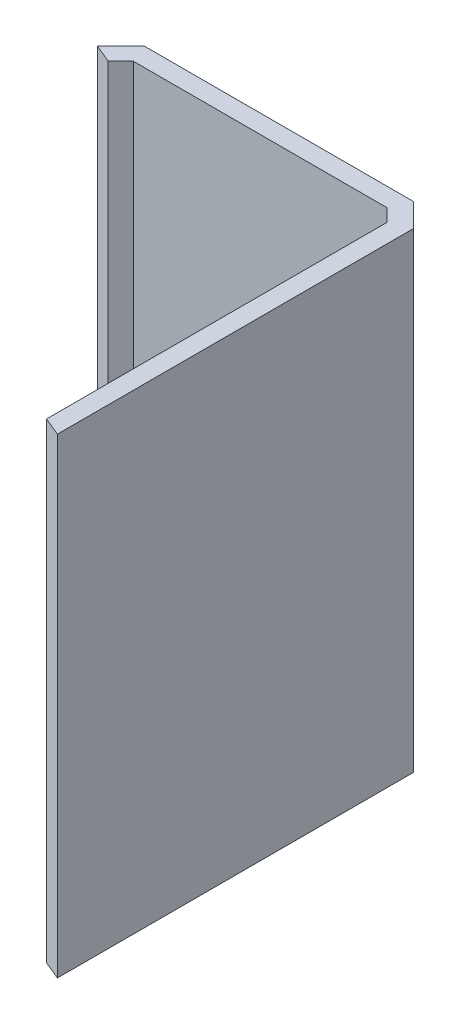
ISO-10303-21;
HEADER;
FILE_DESCRIPTION(('STEP AP214'),'2;1');
FILE_NAME('part.step','',(''),(''),'','','');
FILE_SCHEMA(('AUTOMOTIVE_DESIGN { 1 0 10303 214 1 1 1 1 }'));
ENDSEC;
DATA;
#1=APPLICATION_CONTEXT('core data for automotive mechanical design processes');
#2=APPLICATION_PROTOCOL_DEFINITION('international standard','automotive_design',2000,#1);
#3=PRODUCT_CONTEXT('',#1,'mechanical');
#4=PRODUCT('Part','Part','',(#3));
#5=PRODUCT_RELATED_PRODUCT_CATEGORY('part','',(#4));
#6=PRODUCT_DEFINITION_FORMATION('','',#4);
#7=PRODUCT_DEFINITION_CONTEXT('part definition',#1,'design');
#8=PRODUCT_DEFINITION('design','',#6,#7);
#9=PRODUCT_DEFINITION_SHAPE('','',#8);
#10=(LENGTH_UNIT() NAMED_UNIT(*) SI_UNIT(.MILLI.,.METRE.));
#11=(NAMED_UNIT(*) PLANE_ANGLE_UNIT() SI_UNIT($,.RADIAN.));
#12=(NAMED_UNIT(*) SI_UNIT($,.STERADIAN.) SOLID_ANGLE_UNIT());
#13=UNCERTAINTY_MEASURE_WITH_UNIT(LENGTH_MEASURE(1.E-05),#10,'distance_accuracy_value','');
#14=(GEOMETRIC_REPRESENTATION_CONTEXT(3) GLOBAL_UNCERTAINTY_ASSIGNED_CONTEXT((#13)) GLOBAL_UNIT_ASSIGNED_CONTEXT((#10,
#11,#12)) REPRESENTATION_CONTEXT('',''));
#15=CARTESIAN_POINT('',(0.,0.,0.));
#16=DIRECTION('',(0.,0.,1.));
#17=DIRECTION('',(1.,0.,0.));
#18=AXIS2_PLACEMENT_3D('',#15,#16,#17);
#19=CARTESIAN_POINT('',(-22.0087980285822,76.,-94.1626351578305));
#20=DIRECTION('',(0.382683432365093,0.,-0.923879532511286));
#21=DIRECTION('',(-0.923879532511286,0.,-0.382683432365093));
#22=AXIS2_PLACEMENT_3D('',#19,#20,#21);
#23=PLANE('',#22);
#24=DIRECTION('',(0.923879532511286,0.,0.382683432365093));
#25=VECTOR('',#24,1.);
#26=CARTESIAN_POINT('',(-22.0087980285822,0.,-94.1626351578305));
#27=LINE('',#26,#25);
#28=CARTESIAN_POINT('',(-25.0087980285822,0.,-95.4052758449497));
#29=VERTEX_POINT('',#28);
#30=CARTESIAN_POINT('',(-22.0087980285822,0.,-94.1626351578305));
#31=VERTEX_POINT('',#30);
#32=EDGE_CURVE('E158',#29,#31,#27,.T.);
#33=ORIENTED_EDGE('',*,*,#32,.T.);
#34=DIRECTION('',(0.,-1.,0.));
#35=VECTOR('',#34,1.);
#36=CARTESIAN_POINT('',(-22.0087980285822,76.,-94.1626351578305));
#37=LINE('',#36,#35);
#38=CARTESIAN_POINT('',(-22.0087980285822,76.,-94.1626351578305));
#39=VERTEX_POINT('',#38);
#40=EDGE_CURVE('E11',#39,#31,#37,.T.);
#41=ORIENTED_EDGE('',*,*,#40,.F.);
#42=DIRECTION('',(0.923879532511286,0.,0.382683432365093));
#43=VECTOR('',#42,1.);
#44=CARTESIAN_POINT('',(-22.0087980285822,76.,-94.1626351578305));
#45=LINE('',#44,#43);
#46=CARTESIAN_POINT('',(-25.0087980285822,76.,-95.4052758449497));
#47=VERTEX_POINT('',#46);
#48=EDGE_CURVE('E186',#47,#39,#45,.T.);
#49=ORIENTED_EDGE('',*,*,#48,.F.);
#50=DIRECTION('',(0.,-1.,0.));
#51=VECTOR('',#50,1.);
#52=CARTESIAN_POINT('',(-25.0087980285822,76.,-95.4052758449497));
#53=LINE('',#52,#51);
#54=EDGE_CURVE('E154',#47,#29,#53,.T.);
#55=ORIENTED_EDGE('',*,*,#54,.T.);
#56=EDGE_LOOP('',(#33,#41,#49,#55));
#57=FACE_BOUND('',#56,.T.);
#58=ADVANCED_FACE('F45',(#57),#23,.F.);
#59=CARTESIAN_POINT('',(-19.9897395198799,76.,-96.1816936665328));
#60=DIRECTION('',(-0.707106781186553,0.,-0.707106781186542));
#61=DIRECTION('',(-0.707106781186542,0.,0.707106781186553));
#62=AXIS2_PLACEMENT_3D('',#59,#60,#61);
#63=PLANE('',#62);
#64=DIRECTION('',(0.707106781186542,0.,-0.707106781186553));
#65=VECTOR('',#64,1.);
#66=CARTESIAN_POINT('',(-19.9897395198799,0.,-96.1816936665328));
#67=LINE('',#66,#65);
#68=CARTESIAN_POINT('',(-19.9897395198799,0.,-96.1816936665328));
#69=VERTEX_POINT('',#68);
#70=EDGE_CURVE('E162',#31,#69,#67,.T.);
#71=ORIENTED_EDGE('',*,*,#70,.T.);
#72=DIRECTION('',(0.,-1.,0.));
#73=VECTOR('',#72,1.);
#74=CARTESIAN_POINT('',(-19.9897395198799,76.,-96.1816936665328));
#75=LINE('',#74,#73);
#76=CARTESIAN_POINT('',(-19.9897395198799,76.,-96.1816936665328));
#77=VERTEX_POINT('',#76);
#78=EDGE_CURVE('E54',#77,#69,#75,.T.);
#79=ORIENTED_EDGE('',*,*,#78,.F.);
#80=DIRECTION('',(0.707106781186542,0.,-0.707106781186553));
#81=VECTOR('',#80,1.);
#82=CARTESIAN_POINT('',(-19.9897395198799,76.,-96.1816936665328));
#83=LINE('',#82,#81);
#84=EDGE_CURVE('E111',#39,#77,#83,.T.);
#85=ORIENTED_EDGE('',*,*,#84,.F.);
#86=ORIENTED_EDGE('',*,*,#40,.T.);
#87=EDGE_LOOP('',(#71,#79,#85,#86));
#88=FACE_BOUND('',#87,.T.);
#89=ADVANCED_FACE('F250',(#88),#63,.F.);
#90=CARTESIAN_POINT('',(20.9912019714177,76.,-96.1816936665333));
#91=DIRECTION('',(0.,0.,-1.));
#92=DIRECTION('',(-1.,0.,0.));
#93=AXIS2_PLACEMENT_3D('',#90,#91,#92);
#94=PLANE('',#93);
#95=DIRECTION('',(1.,0.,0.));
#96=VECTOR('',#95,1.);
#97=CARTESIAN_POINT('',(20.9912019714177,0.,-96.1816936665333));
#98=LINE('',#97,#96);
#99=CARTESIAN_POINT('',(20.9912019714177,0.,-96.1816936665333));
#100=VERTEX_POINT('',#99);
#101=EDGE_CURVE('E165',#69,#100,#98,.T.);
#102=ORIENTED_EDGE('',*,*,#101,.T.);
#103=DIRECTION('',(0.,-1.,0.));
#104=VECTOR('',#103,1.);
#105=CARTESIAN_POINT('',(20.9912019714177,76.,-96.1816936665333));
#106=LINE('',#105,#104);
#107=CARTESIAN_POINT('',(20.9912019714177,76.,-96.1816936665333));
#108=VERTEX_POINT('',#107);
#109=EDGE_CURVE('E205',#108,#100,#106,.T.);
#110=ORIENTED_EDGE('',*,*,#109,.F.);
#111=DIRECTION('',(1.,0.,0.));
#112=VECTOR('',#111,1.);
#113=CARTESIAN_POINT('',(20.9912019714177,76.,-96.1816936665333));
#114=LINE('',#113,#112);
#115=EDGE_CURVE('E215',#77,#108,#114,.T.);
#116=ORIENTED_EDGE('',*,*,#115,.F.);
#117=ORIENTED_EDGE('',*,*,#78,.T.);
#118=EDGE_LOOP('',(#102,#110,#116,#117));
#119=FACE_BOUND('',#118,.T.);
#120=ADVANCED_FACE('F213',(#119),#94,.F.);
#121=CARTESIAN_POINT('',(23.0102604801202,76.,-94.1626351578308));
#122=DIRECTION('',(0.707106781186537,0.,-0.707106781186558));
#123=DIRECTION('',(-0.707106781186558,0.,-0.707106781186537));
#124=AXIS2_PLACEMENT_3D('',#121,#122,#123);
#125=PLANE('',#124);
#126=DIRECTION('',(0.707106781186558,0.,0.707106781186537));
#127=VECTOR('',#126,1.);
#128=CARTESIAN_POINT('',(23.0102604801202,0.,-94.1626351578308));
#129=LINE('',#128,#127);
#130=CARTESIAN_POINT('',(23.0102604801202,0.,-94.1626351578308));
#131=VERTEX_POINT('',#130);
#132=EDGE_CURVE('E168',#100,#131,#129,.T.);
#133=ORIENTED_EDGE('',*,*,#132,.T.);
#134=DIRECTION('',(0.,-1.,0.));
#135=VECTOR('',#134,1.);
#136=CARTESIAN_POINT('',(23.0102604801202,76.,-94.1626351578308));
#137=LINE('',#136,#135);
#138=CARTESIAN_POINT('',(23.0102604801202,76.,-94.1626351578308));
#139=VERTEX_POINT('',#138);
#140=EDGE_CURVE('E201',#139,#131,#137,.T.);
#141=ORIENTED_EDGE('',*,*,#140,.F.);
#142=DIRECTION('',(0.707106781186558,0.,0.707106781186537));
#143=VECTOR('',#142,1.);
#144=CARTESIAN_POINT('',(23.0102604801202,76.,-94.1626351578308));
#145=LINE('',#144,#143);
#146=EDGE_CURVE('E234',#108,#139,#145,.T.);
#147=ORIENTED_EDGE('',*,*,#146,.F.);
#148=ORIENTED_EDGE('',*,*,#109,.T.);
#149=EDGE_LOOP('',(#133,#141,#147,#148));
#150=FACE_BOUND('',#149,.T.);
#151=ADVANCED_FACE('F224',(#150),#125,.F.);
#152=CARTESIAN_POINT('',(23.0102604801208,76.,-39.1816936665334));
#153=DIRECTION('',(1.,0.,0.));
#154=DIRECTION('',(0.,0.,-1.));
#155=AXIS2_PLACEMENT_3D('',#152,#153,#154);
#156=PLANE('',#155);
#157=DIRECTION('',(0.,0.,1.));
#158=VECTOR('',#157,1.);
#159=CARTESIAN_POINT('',(23.0102604801208,0.,-39.1816936665334));
#160=LINE('',#159,#158);
#161=CARTESIAN_POINT('',(23.0102604801208,0.,-39.1816936665334));
#162=VERTEX_POINT('',#161);
#163=EDGE_CURVE('E171',#131,#162,#160,.T.);
#164=ORIENTED_EDGE('',*,*,#163,.T.);
#165=DIRECTION('',(0.,-1.,0.));
#166=VECTOR('',#165,1.);
#167=CARTESIAN_POINT('',(23.0102604801208,76.,-39.1816936665334));
#168=LINE('',#167,#166);
#169=CARTESIAN_POINT('',(23.0102604801208,76.,-39.1816936665334));
#170=VERTEX_POINT('',#169);
#171=EDGE_CURVE('E197',#170,#162,#168,.T.);
#172=ORIENTED_EDGE('',*,*,#171,.F.);
#173=DIRECTION('',(0.,0.,1.));
#174=VECTOR('',#173,1.);
#175=CARTESIAN_POINT('',(23.0102604801208,76.,-39.1816936665334));
#176=LINE('',#175,#174);
#177=EDGE_CURVE('E230',#139,#170,#176,.T.);
#178=ORIENTED_EDGE('',*,*,#177,.F.);
#179=ORIENTED_EDGE('',*,*,#140,.T.);
#180=EDGE_LOOP('',(#164,#172,#178,#179));
#181=FACE_BOUND('',#180,.T.);
#182=ADVANCED_FACE('F228',(#181),#156,.F.);
#183=CARTESIAN_POINT('',(26.0102604801207,76.,-37.9390529794138));
#184=DIRECTION('',(0.382683432365184,0.,-0.923879532511248));
#185=DIRECTION('',(-0.923879532511248,0.,-0.382683432365184));
#186=AXIS2_PLACEMENT_3D('',#183,#184,#185);
#187=PLANE('',#186);
#188=DIRECTION('',(0.923879532511248,0.,0.382683432365184));
#189=VECTOR('',#188,1.);
#190=CARTESIAN_POINT('',(26.0102604801207,0.,-37.9390529794138));
#191=LINE('',#190,#189);
#192=CARTESIAN_POINT('',(26.0102604801207,0.,-37.9390529794138));
#193=VERTEX_POINT('',#192);
#194=EDGE_CURVE('E174',#162,#193,#191,.T.);
#195=ORIENTED_EDGE('',*,*,#194,.T.);
#196=DIRECTION('',(0.,-1.,0.));
#197=VECTOR('',#196,1.);
#198=CARTESIAN_POINT('',(26.0102604801207,76.,-37.9390529794138));
#199=LINE('',#198,#197);
#200=CARTESIAN_POINT('',(26.0102604801207,76.,-37.9390529794138));
#201=VERTEX_POINT('',#200);
#202=EDGE_CURVE('E193',#201,#193,#199,.T.);
#203=ORIENTED_EDGE('',*,*,#202,.F.);
#204=DIRECTION('',(0.923879532511248,0.,0.382683432365184));
#205=VECTOR('',#204,1.);
#206=CARTESIAN_POINT('',(26.0102604801207,76.,-37.9390529794138));
#207=LINE('',#206,#205);
#208=EDGE_CURVE('E233',#170,#201,#207,.T.);
#209=ORIENTED_EDGE('',*,*,#208,.F.);
#210=ORIENTED_EDGE('',*,*,#171,.T.);
#211=EDGE_LOOP('',(#195,#203,#209,#210));
#212=FACE_BOUND('',#211,.T.);
#213=ADVANCED_FACE('F262',(#212),#187,.F.);
#214=CARTESIAN_POINT('',(26.0102604801202,76.,-95.4052758449502));
#215=DIRECTION('',(-1.,0.,0.));
#216=DIRECTION('',(0.,0.,1.));
#217=AXIS2_PLACEMENT_3D('',#214,#215,#216);
#218=PLANE('',#217);
#219=DIRECTION('',(0.,0.,-1.));
#220=VECTOR('',#219,1.);
#221=CARTESIAN_POINT('',(26.0102604801202,0.,-95.4052758449502));
#222=LINE('',#221,#220);
#223=CARTESIAN_POINT('',(26.0102604801202,0.,-95.4052758449502));
#224=VERTEX_POINT('',#223);
#225=EDGE_CURVE('E177',#193,#224,#222,.T.);
#226=ORIENTED_EDGE('',*,*,#225,.T.);
#227=DIRECTION('',(0.,-1.,0.));
#228=VECTOR('',#227,1.);
#229=CARTESIAN_POINT('',(26.0102604801202,76.,-95.4052758449502));
#230=LINE('',#229,#228);
#231=CARTESIAN_POINT('',(26.0102604801202,76.,-95.4052758449502));
#232=VERTEX_POINT('',#231);
#233=EDGE_CURVE('E147',#232,#224,#230,.T.);
#234=ORIENTED_EDGE('',*,*,#233,.F.);
#235=DIRECTION('',(0.,0.,-1.));
#236=VECTOR('',#235,1.);
#237=CARTESIAN_POINT('',(26.0102604801202,76.,-95.4052758449502));
#238=LINE('',#237,#236);
#239=EDGE_CURVE('E136',#201,#232,#238,.T.);
#240=ORIENTED_EDGE('',*,*,#239,.F.);
#241=ORIENTED_EDGE('',*,*,#202,.T.);
#242=EDGE_LOOP('',(#226,#234,#240,#241));
#243=FACE_BOUND('',#242,.T.);
#244=ADVANCED_FACE('F265',(#243),#218,.F.);
#245=CARTESIAN_POINT('',(22.2338426585371,76.,-99.1816936665333));
#246=DIRECTION('',(-0.707106781186546,0.,0.70710678118655));
#247=DIRECTION('',(0.70710678118655,0.,0.707106781186546));
#248=AXIS2_PLACEMENT_3D('',#245,#246,#247);
#249=PLANE('',#248);
#250=DIRECTION('',(-0.707106781186549,0.,-0.707106781186545));
#251=VECTOR('',#250,1.);
#252=CARTESIAN_POINT('',(22.2338426585371,0.,-99.1816936665333));
#253=LINE('',#252,#251);
#254=CARTESIAN_POINT('',(22.2338426585371,0.,-99.1816936665333));
#255=VERTEX_POINT('',#254);
#256=EDGE_CURVE('E145',#224,#255,#253,.T.);
#257=ORIENTED_EDGE('',*,*,#256,.T.);
#258=DIRECTION('',(0.,-1.,0.));
#259=VECTOR('',#258,1.);
#260=CARTESIAN_POINT('',(22.2338426585371,76.,-99.1816936665333));
#261=LINE('',#260,#259);
#262=CARTESIAN_POINT('',(22.2338426585371,76.,-99.1816936665333));
#263=VERTEX_POINT('',#262);
#264=EDGE_CURVE('E142',#263,#255,#261,.T.);
#265=ORIENTED_EDGE('',*,*,#264,.F.);
#266=DIRECTION('',(-0.707106781186549,0.,-0.707106781186545));
#267=VECTOR('',#266,1.);
#268=CARTESIAN_POINT('',(22.2338426585371,76.,-99.1816936665333));
#269=LINE('',#268,#267);
#270=EDGE_CURVE('E130',#232,#263,#269,.T.);
#271=ORIENTED_EDGE('',*,*,#270,.F.);
#272=ORIENTED_EDGE('',*,*,#233,.T.);
#273=EDGE_LOOP('',(#257,#265,#271,#272));
#274=FACE_BOUND('',#273,.T.);
#275=ADVANCED_FACE('F143',(#274),#249,.F.);
#276=CARTESIAN_POINT('',(-21.2323802069992,76.,-99.1816936665328));
#277=DIRECTION('',(0.,0.,1.));
#278=DIRECTION('',(1.,0.,0.));
#279=AXIS2_PLACEMENT_3D('',#276,#277,#278);
#280=PLANE('',#279);
#281=DIRECTION('',(-1.,0.,0.));
#282=VECTOR('',#281,1.);
#283=CARTESIAN_POINT('',(-21.2323802069992,0.,-99.1816936665328));
#284=LINE('',#283,#282);
#285=CARTESIAN_POINT('',(-21.2323802069992,0.,-99.1816936665328));
#286=VERTEX_POINT('',#285);
#287=EDGE_CURVE('E97',#255,#286,#284,.T.);
#288=ORIENTED_EDGE('',*,*,#287,.T.);
#289=DIRECTION('',(0.,-1.,0.));
#290=VECTOR('',#289,1.);
#291=CARTESIAN_POINT('',(-21.2323802069992,76.,-99.1816936665328));
#292=LINE('',#291,#290);
#293=CARTESIAN_POINT('',(-21.2323802069992,76.,-99.1816936665328));
#294=VERTEX_POINT('',#293);
#295=EDGE_CURVE('E148',#294,#286,#292,.T.);
#296=ORIENTED_EDGE('',*,*,#295,.F.);
#297=DIRECTION('',(-1.,0.,0.));
#298=VECTOR('',#297,1.);
#299=CARTESIAN_POINT('',(-21.2323802069992,76.,-99.1816936665328));
#300=LINE('',#299,#298);
#301=EDGE_CURVE('E134',#263,#294,#300,.T.);
#302=ORIENTED_EDGE('',*,*,#301,.F.);
#303=ORIENTED_EDGE('',*,*,#264,.T.);
#304=EDGE_LOOP('',(#288,#296,#302,#303));
#305=FACE_BOUND('',#304,.T.);
#306=ADVANCED_FACE('F150',(#305),#280,.F.);
#307=CARTESIAN_POINT('',(-25.0087980285822,76.,-95.4052758449497));
#308=DIRECTION('',(0.707106781186554,0.,0.707106781186541));
#309=DIRECTION('',(0.707106781186541,0.,-0.707106781186554));
#310=AXIS2_PLACEMENT_3D('',#307,#308,#309);
#311=PLANE('',#310);
#312=DIRECTION('',(-0.707106781186541,0.,0.707106781186554));
#313=VECTOR('',#312,1.);
#314=CARTESIAN_POINT('',(-25.0087980285822,0.,-95.4052758449497));
#315=LINE('',#314,#313);
#316=EDGE_CURVE('E103',#286,#29,#315,.T.);
#317=ORIENTED_EDGE('',*,*,#316,.T.);
#318=ORIENTED_EDGE('',*,*,#54,.F.);
#319=DIRECTION('',(-0.707106781186541,0.,0.707106781186554));
#320=VECTOR('',#319,1.);
#321=CARTESIAN_POINT('',(-25.0087980285822,76.,-95.4052758449497));
#322=LINE('',#321,#320);
#323=EDGE_CURVE('E62',#294,#47,#322,.T.);
#324=ORIENTED_EDGE('',*,*,#323,.F.);
#325=ORIENTED_EDGE('',*,*,#295,.T.);
#326=EDGE_LOOP('',(#317,#318,#324,#325));
#327=FACE_BOUND('',#326,.T.);
#328=ADVANCED_FACE('F274',(#327),#311,.F.);
#329=CARTESIAN_POINT('',(0.,76.,0.));
#330=DIRECTION('',(0.,-1.,0.));
#331=DIRECTION('',(0.,0.,-1.));
#332=AXIS2_PLACEMENT_3D('',#329,#330,#331);
#333=PLANE('',#332);
#334=ORIENTED_EDGE('',*,*,#48,.T.);
#335=ORIENTED_EDGE('',*,*,#84,.T.);
#336=ORIENTED_EDGE('',*,*,#115,.T.);
#337=ORIENTED_EDGE('',*,*,#146,.T.);
#338=ORIENTED_EDGE('',*,*,#177,.T.);
#339=ORIENTED_EDGE('',*,*,#208,.T.);
#340=ORIENTED_EDGE('',*,*,#239,.T.);
#341=ORIENTED_EDGE('',*,*,#270,.T.);
#342=ORIENTED_EDGE('',*,*,#301,.T.);
#343=ORIENTED_EDGE('',*,*,#323,.T.);
#344=EDGE_LOOP('',(#334,#335,#336,#337,#338,#339,#340,#341,#342,#343));
#345=FACE_BOUND('',#344,.T.);
#346=ADVANCED_FACE('F132',(#345),#333,.F.);
#347=CARTESIAN_POINT('',(0.,0.,0.));
#348=DIRECTION('',(0.,-1.,0.));
#349=DIRECTION('',(0.,0.,-1.));
#350=AXIS2_PLACEMENT_3D('',#347,#348,#349);
#351=PLANE('',#350);
#352=ORIENTED_EDGE('',*,*,#32,.F.);
#353=ORIENTED_EDGE('',*,*,#316,.F.);
#354=ORIENTED_EDGE('',*,*,#287,.F.);
#355=ORIENTED_EDGE('',*,*,#256,.F.);
#356=ORIENTED_EDGE('',*,*,#225,.F.);
#357=ORIENTED_EDGE('',*,*,#194,.F.);
#358=ORIENTED_EDGE('',*,*,#163,.F.);
#359=ORIENTED_EDGE('',*,*,#132,.F.);
#360=ORIENTED_EDGE('',*,*,#101,.F.);
#361=ORIENTED_EDGE('',*,*,#70,.F.);
#362=EDGE_LOOP('',(#352,#353,#354,#355,#356,#357,#358,#359,#360,#361));
#363=FACE_BOUND('',#362,.T.);
#364=ADVANCED_FACE('F219',(#363),#351,.T.);
#365=CLOSED_SHELL('',(#58,#89,#120,#151,#182,#213,#244,#275,#306,#328,#346,#364));
#366=MANIFOLD_SOLID_BREP('B2',#365);
#367=ADVANCED_BREP_SHAPE_REPRESENTATION('',(#18,#366),#14);
#368=SHAPE_DEFINITION_REPRESENTATION(#9,#367);
ENDSEC;
END-ISO-10303-21;
